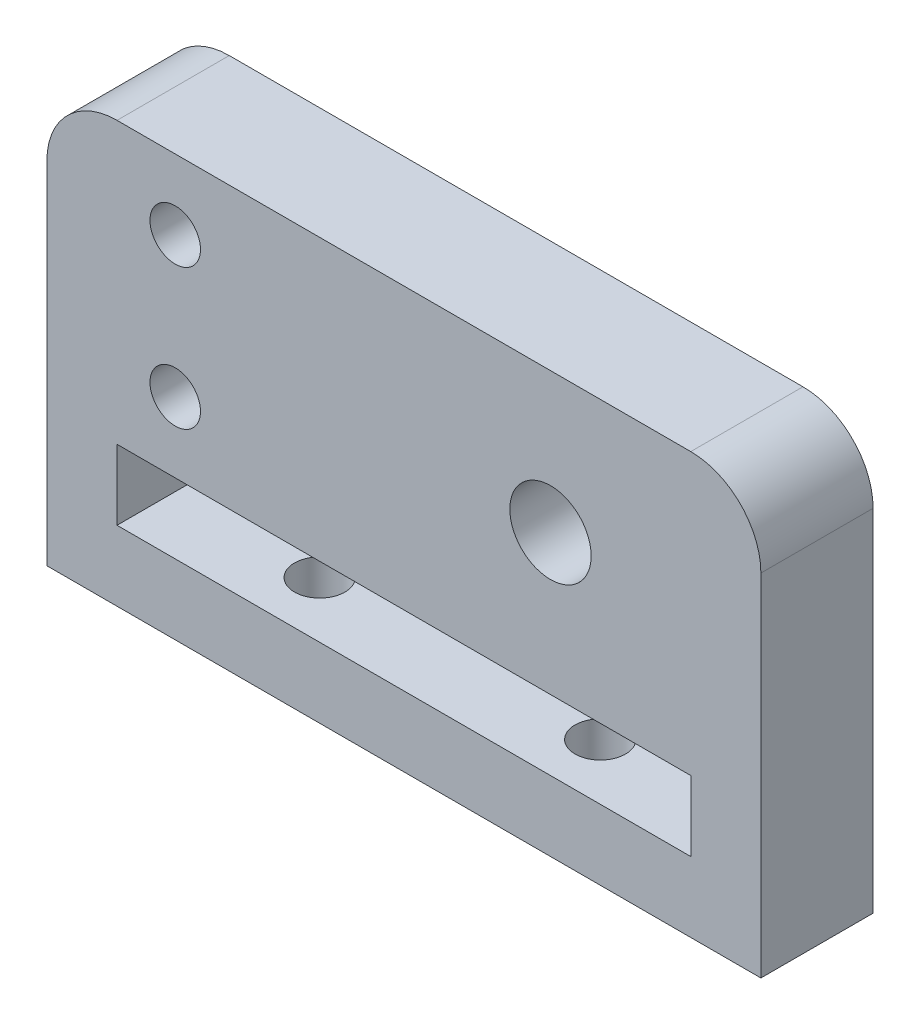
ISO-10303-21;
HEADER;
FILE_DESCRIPTION(('STEP AP214'),'2;1');
FILE_NAME('part.step','',(''),(''),'','','');
FILE_SCHEMA(('AUTOMOTIVE_DESIGN { 1 0 10303 214 1 1 1 1 }'));
ENDSEC;
DATA;
#1=APPLICATION_CONTEXT('core data for automotive mechanical design processes');
#2=APPLICATION_PROTOCOL_DEFINITION('international standard','automotive_design',2000,#1);
#3=PRODUCT_CONTEXT('',#1,'mechanical');
#4=PRODUCT('Part','Part','',(#3));
#5=PRODUCT_RELATED_PRODUCT_CATEGORY('part','',(#4));
#6=PRODUCT_DEFINITION_FORMATION('','',#4);
#7=PRODUCT_DEFINITION_CONTEXT('part definition',#1,'design');
#8=PRODUCT_DEFINITION('design','',#6,#7);
#9=PRODUCT_DEFINITION_SHAPE('','',#8);
#10=(LENGTH_UNIT() NAMED_UNIT(*) SI_UNIT(.MILLI.,.METRE.));
#11=(NAMED_UNIT(*) PLANE_ANGLE_UNIT() SI_UNIT($,.RADIAN.));
#12=(NAMED_UNIT(*) SI_UNIT($,.STERADIAN.) SOLID_ANGLE_UNIT());
#13=UNCERTAINTY_MEASURE_WITH_UNIT(LENGTH_MEASURE(1.E-05),#10,'distance_accuracy_value','');
#14=(GEOMETRIC_REPRESENTATION_CONTEXT(3) GLOBAL_UNCERTAINTY_ASSIGNED_CONTEXT((#13)) GLOBAL_UNIT_ASSIGNED_CONTEXT((#10,
#11,#12)) REPRESENTATION_CONTEXT('',''));
#15=CARTESIAN_POINT('',(0.,0.,0.));
#16=DIRECTION('',(0.,0.,1.));
#17=DIRECTION('',(1.,0.,0.));
#18=AXIS2_PLACEMENT_3D('',#15,#16,#17);
#19=CARTESIAN_POINT('',(0.,0.,8.));
#20=DIRECTION('',(0.,0.,1.));
#21=DIRECTION('',(1.,0.,0.));
#22=AXIS2_PLACEMENT_3D('',#19,#20,#21);
#23=PLANE('',#22);
#24=CARTESIAN_POINT('',(9.15,25.,8.));
#25=DIRECTION('',(0.,0.,1.));
#26=DIRECTION('',(1.,0.,0.));
#27=AXIS2_PLACEMENT_3D('',#24,#25,#26);
#28=CIRCLE('',#27,1.8);
#29=CARTESIAN_POINT('',(10.95,25.,8.));
#30=VERTEX_POINT('',#29);
#31=EDGE_CURVE('E281',#30,#30,#28,.T.);
#32=ORIENTED_EDGE('',*,*,#31,.F.);
#33=EDGE_LOOP('',(#32));
#34=FACE_BOUND('',#33,.T.);
#35=CARTESIAN_POINT('',(9.15,15.,8.));
#36=DIRECTION('',(0.,0.,1.));
#37=DIRECTION('',(1.,0.,0.));
#38=AXIS2_PLACEMENT_3D('',#35,#36,#37);
#39=CIRCLE('',#38,1.8);
#40=CARTESIAN_POINT('',(10.95,15.,8.));
#41=VERTEX_POINT('',#40);
#42=EDGE_CURVE('E274',#41,#41,#39,.T.);
#43=ORIENTED_EDGE('',*,*,#42,.F.);
#44=EDGE_LOOP('',(#43));
#45=FACE_BOUND('',#44,.T.);
#46=DIRECTION('',(0.,-1.,0.));
#47=VECTOR('',#46,1.);
#48=CARTESIAN_POINT('',(5.,10.,8.));
#49=LINE('',#48,#47);
#50=CARTESIAN_POINT('',(5.,10.,8.));
#51=VERTEX_POINT('',#50);
#52=CARTESIAN_POINT('',(5.,5.,8.));
#53=VERTEX_POINT('',#52);
#54=EDGE_CURVE('E137',#51,#53,#49,.T.);
#55=ORIENTED_EDGE('',*,*,#54,.F.);
#56=DIRECTION('',(-1.,0.,0.));
#57=VECTOR('',#56,1.);
#58=CARTESIAN_POINT('',(5.,10.,8.));
#59=LINE('',#58,#57);
#60=CARTESIAN_POINT('',(45.9,10.,8.));
#61=VERTEX_POINT('',#60);
#62=EDGE_CURVE('E126',#61,#51,#59,.T.);
#63=ORIENTED_EDGE('',*,*,#62,.F.);
#64=DIRECTION('',(0.,1.,0.));
#65=VECTOR('',#64,1.);
#66=CARTESIAN_POINT('',(45.9,10.,8.));
#67=LINE('',#66,#65);
#68=CARTESIAN_POINT('',(45.9,5.00000000000001,8.));
#69=VERTEX_POINT('',#68);
#70=EDGE_CURVE('E155',#69,#61,#67,.T.);
#71=ORIENTED_EDGE('',*,*,#70,.F.);
#72=DIRECTION('',(1.,0.,0.));
#73=VECTOR('',#72,1.);
#74=CARTESIAN_POINT('',(5.,5.,8.));
#75=LINE('',#74,#73);
#76=EDGE_CURVE('E151',#53,#69,#75,.T.);
#77=ORIENTED_EDGE('',*,*,#76,.F.);
#78=EDGE_LOOP('',(#55,#63,#71,#77));
#79=FACE_BOUND('',#78,.T.);
#80=DIRECTION('',(0.,1.,0.));
#81=VECTOR('',#80,1.);
#82=CARTESIAN_POINT('',(50.9,0.,8.));
#83=LINE('',#82,#81);
#84=CARTESIAN_POINT('',(50.9,0.,8.));
#85=VERTEX_POINT('',#84);
#86=CARTESIAN_POINT('',(50.9,25.,8.));
#87=VERTEX_POINT('',#86);
#88=EDGE_CURVE('E185',#85,#87,#83,.T.);
#89=ORIENTED_EDGE('',*,*,#88,.T.);
#90=CARTESIAN_POINT('',(45.9,25.,8.));
#91=DIRECTION('',(0.,0.,1.));
#92=DIRECTION('',(1.,0.,0.));
#93=AXIS2_PLACEMENT_3D('',#90,#91,#92);
#94=CIRCLE('',#93,5.);
#95=CARTESIAN_POINT('',(45.9,30.,8.));
#96=VERTEX_POINT('',#95);
#97=EDGE_CURVE('E53',#87,#96,#94,.T.);
#98=ORIENTED_EDGE('',*,*,#97,.T.);
#99=DIRECTION('',(-1.,0.,0.));
#100=VECTOR('',#99,1.);
#101=CARTESIAN_POINT('',(0.,30.,8.));
#102=LINE('',#101,#100);
#103=CARTESIAN_POINT('',(5.,30.,8.));
#104=VERTEX_POINT('',#103);
#105=EDGE_CURVE('E189',#96,#104,#102,.T.);
#106=ORIENTED_EDGE('',*,*,#105,.T.);
#107=CARTESIAN_POINT('',(5.,25.,8.));
#108=DIRECTION('',(0.,0.,1.));
#109=DIRECTION('',(1.,0.,0.));
#110=AXIS2_PLACEMENT_3D('',#107,#108,#109);
#111=CIRCLE('',#110,5.);
#112=CARTESIAN_POINT('',(0.,25.,8.));
#113=VERTEX_POINT('',#112);
#114=EDGE_CURVE('E61',#104,#113,#111,.T.);
#115=ORIENTED_EDGE('',*,*,#114,.T.);
#116=DIRECTION('',(0.,-1.,0.));
#117=VECTOR('',#116,1.);
#118=CARTESIAN_POINT('',(0.,0.,8.));
#119=LINE('',#118,#117);
#120=CARTESIAN_POINT('',(0.,0.,8.));
#121=VERTEX_POINT('',#120);
#122=EDGE_CURVE('E192',#113,#121,#119,.T.);
#123=ORIENTED_EDGE('',*,*,#122,.T.);
#124=DIRECTION('',(1.,0.,0.));
#125=VECTOR('',#124,1.);
#126=CARTESIAN_POINT('',(0.,0.,8.));
#127=LINE('',#126,#125);
#128=EDGE_CURVE('E181',#121,#85,#127,.T.);
#129=ORIENTED_EDGE('',*,*,#128,.T.);
#130=EDGE_LOOP('',(#89,#98,#106,#115,#123,#129));
#131=FACE_BOUND('',#130,.T.);
#132=CARTESIAN_POINT('',(35.9,20.,8.));
#133=DIRECTION('',(0.,0.,1.));
#134=DIRECTION('',(1.,0.,0.));
#135=AXIS2_PLACEMENT_3D('',#132,#133,#134);
#136=CIRCLE('',#135,2.9);
#137=CARTESIAN_POINT('',(38.8,20.,8.));
#138=VERTEX_POINT('',#137);
#139=EDGE_CURVE('E164',#138,#138,#136,.T.);
#140=ORIENTED_EDGE('',*,*,#139,.F.);
#141=EDGE_LOOP('',(#140));
#142=FACE_BOUND('',#141,.T.);
#143=ADVANCED_FACE('F43',(#34,#45,#79,#131,#142),#23,.T.);
#144=CARTESIAN_POINT('',(0.,0.,0.));
#145=DIRECTION('',(0.,0.,1.));
#146=DIRECTION('',(1.,0.,0.));
#147=AXIS2_PLACEMENT_3D('',#144,#145,#146);
#148=PLANE('',#147);
#149=CARTESIAN_POINT('',(9.15,25.,0.));
#150=DIRECTION('',(0.,0.,-1.));
#151=DIRECTION('',(-1.,0.,0.));
#152=AXIS2_PLACEMENT_3D('',#149,#150,#151);
#153=CIRCLE('',#152,1.8);
#154=CARTESIAN_POINT('',(7.35,25.,0.));
#155=VERTEX_POINT('',#154);
#156=EDGE_CURVE('E270',#155,#155,#153,.T.);
#157=ORIENTED_EDGE('',*,*,#156,.F.);
#158=EDGE_LOOP('',(#157));
#159=FACE_BOUND('',#158,.T.);
#160=CARTESIAN_POINT('',(9.15,15.,0.));
#161=DIRECTION('',(0.,0.,-1.));
#162=DIRECTION('',(-1.,0.,0.));
#163=AXIS2_PLACEMENT_3D('',#160,#161,#162);
#164=CIRCLE('',#163,1.8);
#165=CARTESIAN_POINT('',(7.35,15.,0.));
#166=VERTEX_POINT('',#165);
#167=EDGE_CURVE('E252',#166,#166,#164,.T.);
#168=ORIENTED_EDGE('',*,*,#167,.F.);
#169=EDGE_LOOP('',(#168));
#170=FACE_BOUND('',#169,.T.);
#171=DIRECTION('',(-1.,0.,0.));
#172=VECTOR('',#171,1.);
#173=CARTESIAN_POINT('',(0.,30.,0.));
#174=LINE('',#173,#172);
#175=CARTESIAN_POINT('',(45.9,30.,0.));
#176=VERTEX_POINT('',#175);
#177=CARTESIAN_POINT('',(5.,30.,0.));
#178=VERTEX_POINT('',#177);
#179=EDGE_CURVE('E202',#176,#178,#174,.T.);
#180=ORIENTED_EDGE('',*,*,#179,.F.);
#181=CARTESIAN_POINT('',(45.9,25.,0.));
#182=DIRECTION('',(0.,0.,1.));
#183=DIRECTION('',(1.,0.,0.));
#184=AXIS2_PLACEMENT_3D('',#181,#182,#183);
#185=CIRCLE('',#184,5.);
#186=CARTESIAN_POINT('',(50.9,25.,0.));
#187=VERTEX_POINT('',#186);
#188=EDGE_CURVE('E235',#176,#187,#185,.F.);
#189=ORIENTED_EDGE('',*,*,#188,.T.);
#190=DIRECTION('',(0.,1.,0.));
#191=VECTOR('',#190,1.);
#192=CARTESIAN_POINT('',(50.9,0.,0.));
#193=LINE('',#192,#191);
#194=CARTESIAN_POINT('',(50.9,0.,0.));
#195=VERTEX_POINT('',#194);
#196=EDGE_CURVE('E199',#195,#187,#193,.T.);
#197=ORIENTED_EDGE('',*,*,#196,.F.);
#198=DIRECTION('',(1.,0.,0.));
#199=VECTOR('',#198,1.);
#200=CARTESIAN_POINT('',(0.,0.,0.));
#201=LINE('',#200,#199);
#202=CARTESIAN_POINT('',(0.,0.,0.));
#203=VERTEX_POINT('',#202);
#204=EDGE_CURVE('E146',#203,#195,#201,.T.);
#205=ORIENTED_EDGE('',*,*,#204,.F.);
#206=DIRECTION('',(0.,-1.,0.));
#207=VECTOR('',#206,1.);
#208=CARTESIAN_POINT('',(0.,0.,0.));
#209=LINE('',#208,#207);
#210=CARTESIAN_POINT('',(0.,25.,0.));
#211=VERTEX_POINT('',#210);
#212=EDGE_CURVE('E186',#211,#203,#209,.T.);
#213=ORIENTED_EDGE('',*,*,#212,.F.);
#214=CARTESIAN_POINT('',(5.,25.,0.));
#215=DIRECTION('',(0.,0.,1.));
#216=DIRECTION('',(1.,0.,0.));
#217=AXIS2_PLACEMENT_3D('',#214,#215,#216);
#218=CIRCLE('',#217,5.);
#219=EDGE_CURVE('E232',#211,#178,#218,.F.);
#220=ORIENTED_EDGE('',*,*,#219,.T.);
#221=EDGE_LOOP('',(#180,#189,#197,#205,#213,#220));
#222=FACE_BOUND('',#221,.T.);
#223=DIRECTION('',(-1.,0.,0.));
#224=VECTOR('',#223,1.);
#225=CARTESIAN_POINT('',(5.,10.,0.));
#226=LINE('',#225,#224);
#227=CARTESIAN_POINT('',(45.9,10.,0.));
#228=VERTEX_POINT('',#227);
#229=CARTESIAN_POINT('',(5.,10.,0.));
#230=VERTEX_POINT('',#229);
#231=EDGE_CURVE('E161',#228,#230,#226,.T.);
#232=ORIENTED_EDGE('',*,*,#231,.T.);
#233=DIRECTION('',(0.,-1.,0.));
#234=VECTOR('',#233,1.);
#235=CARTESIAN_POINT('',(5.,10.,0.));
#236=LINE('',#235,#234);
#237=CARTESIAN_POINT('',(5.,5.,0.));
#238=VERTEX_POINT('',#237);
#239=EDGE_CURVE('E144',#230,#238,#236,.T.);
#240=ORIENTED_EDGE('',*,*,#239,.T.);
#241=DIRECTION('',(1.,0.,0.));
#242=VECTOR('',#241,1.);
#243=CARTESIAN_POINT('',(5.,5.,0.));
#244=LINE('',#243,#242);
#245=CARTESIAN_POINT('',(45.9,5.00000000000001,0.));
#246=VERTEX_POINT('',#245);
#247=EDGE_CURVE('E167',#238,#246,#244,.T.);
#248=ORIENTED_EDGE('',*,*,#247,.T.);
#249=DIRECTION('',(0.,1.,0.));
#250=VECTOR('',#249,1.);
#251=CARTESIAN_POINT('',(45.9,10.,0.));
#252=LINE('',#251,#250);
#253=EDGE_CURVE('E138',#246,#228,#252,.T.);
#254=ORIENTED_EDGE('',*,*,#253,.T.);
#255=EDGE_LOOP('',(#232,#240,#248,#254));
#256=FACE_BOUND('',#255,.T.);
#257=CARTESIAN_POINT('',(35.9,20.,0.));
#258=DIRECTION('',(0.,0.,1.));
#259=DIRECTION('',(1.,0.,0.));
#260=AXIS2_PLACEMENT_3D('',#257,#258,#259);
#261=CIRCLE('',#260,2.9);
#262=CARTESIAN_POINT('',(38.8,20.,0.));
#263=VERTEX_POINT('',#262);
#264=EDGE_CURVE('E225',#263,#263,#261,.T.);
#265=ORIENTED_EDGE('',*,*,#264,.T.);
#266=EDGE_LOOP('',(#265));
#267=FACE_BOUND('',#266,.T.);
#268=ADVANCED_FACE('F306',(#159,#170,#222,#256,#267),#148,.F.);
#269=CARTESIAN_POINT('',(0.,0.,8.));
#270=DIRECTION('',(0.,1.,0.));
#271=DIRECTION('',(0.,0.,1.));
#272=AXIS2_PLACEMENT_3D('',#269,#270,#271);
#273=PLANE('',#272);
#274=CARTESIAN_POINT('',(15.45,0.,4.));
#275=DIRECTION('',(0.,-1.,0.));
#276=DIRECTION('',(0.,0.,-1.));
#277=AXIS2_PLACEMENT_3D('',#274,#275,#276);
#278=CIRCLE('',#277,1.8);
#279=CARTESIAN_POINT('',(15.45,0.,2.2));
#280=VERTEX_POINT('',#279);
#281=EDGE_CURVE('E289',#280,#280,#278,.T.);
#282=ORIENTED_EDGE('',*,*,#281,.F.);
#283=EDGE_LOOP('',(#282));
#284=FACE_BOUND('',#283,.T.);
#285=CARTESIAN_POINT('',(35.45,0.,4.));
#286=DIRECTION('',(0.,-1.,0.));
#287=DIRECTION('',(0.,0.,-1.));
#288=AXIS2_PLACEMENT_3D('',#285,#286,#287);
#289=CIRCLE('',#288,1.8);
#290=CARTESIAN_POINT('',(35.45,0.,2.2));
#291=VERTEX_POINT('',#290);
#292=EDGE_CURVE('E293',#291,#291,#289,.T.);
#293=ORIENTED_EDGE('',*,*,#292,.F.);
#294=EDGE_LOOP('',(#293));
#295=FACE_BOUND('',#294,.T.);
#296=ORIENTED_EDGE('',*,*,#204,.T.);
#297=DIRECTION('',(0.,0.,-1.));
#298=VECTOR('',#297,1.);
#299=CARTESIAN_POINT('',(50.9,0.,8.));
#300=LINE('',#299,#298);
#301=EDGE_CURVE('E211',#85,#195,#300,.T.);
#302=ORIENTED_EDGE('',*,*,#301,.F.);
#303=ORIENTED_EDGE('',*,*,#128,.F.);
#304=DIRECTION('',(0.,0.,-1.));
#305=VECTOR('',#304,1.);
#306=CARTESIAN_POINT('',(0.,0.,8.));
#307=LINE('',#306,#305);
#308=EDGE_CURVE('E195',#121,#203,#307,.T.);
#309=ORIENTED_EDGE('',*,*,#308,.T.);
#310=EDGE_LOOP('',(#296,#302,#303,#309));
#311=FACE_BOUND('',#310,.T.);
#312=ADVANCED_FACE('F332',(#284,#295,#311),#273,.F.);
#313=CARTESIAN_POINT('',(50.9,0.,8.));
#314=DIRECTION('',(-1.,0.,0.));
#315=DIRECTION('',(0.,0.,1.));
#316=AXIS2_PLACEMENT_3D('',#313,#314,#315);
#317=PLANE('',#316);
#318=ORIENTED_EDGE('',*,*,#196,.T.);
#319=DIRECTION('',(0.,0.,-1.));
#320=VECTOR('',#319,1.);
#321=CARTESIAN_POINT('',(50.9,25.,8.));
#322=LINE('',#321,#320);
#323=EDGE_CURVE('E69',#187,#87,#322,.F.);
#324=ORIENTED_EDGE('',*,*,#323,.T.);
#325=ORIENTED_EDGE('',*,*,#88,.F.);
#326=ORIENTED_EDGE('',*,*,#301,.T.);
#327=EDGE_LOOP('',(#318,#324,#325,#326));
#328=FACE_BOUND('',#327,.T.);
#329=ADVANCED_FACE('F347',(#328),#317,.F.);
#330=CARTESIAN_POINT('',(0.,30.,8.));
#331=DIRECTION('',(0.,-1.,0.));
#332=DIRECTION('',(1.,0.,0.));
#333=AXIS2_PLACEMENT_3D('',#330,#331,#332);
#334=PLANE('',#333);
#335=ORIENTED_EDGE('',*,*,#105,.F.);
#336=DIRECTION('',(0.,0.,-1.));
#337=VECTOR('',#336,1.);
#338=CARTESIAN_POINT('',(45.9,30.,8.));
#339=LINE('',#338,#337);
#340=EDGE_CURVE('E228',#96,#176,#339,.T.);
#341=ORIENTED_EDGE('',*,*,#340,.T.);
#342=ORIENTED_EDGE('',*,*,#179,.T.);
#343=DIRECTION('',(0.,0.,-1.));
#344=VECTOR('',#343,1.);
#345=CARTESIAN_POINT('',(5.,30.,8.));
#346=LINE('',#345,#344);
#347=EDGE_CURVE('E215',#178,#104,#346,.F.);
#348=ORIENTED_EDGE('',*,*,#347,.T.);
#349=EDGE_LOOP('',(#335,#341,#342,#348));
#350=FACE_BOUND('',#349,.T.);
#351=ADVANCED_FACE('F343',(#350),#334,.F.);
#352=CARTESIAN_POINT('',(0.,0.,8.));
#353=DIRECTION('',(1.,0.,0.));
#354=DIRECTION('',(0.,0.,-1.));
#355=AXIS2_PLACEMENT_3D('',#352,#353,#354);
#356=PLANE('',#355);
#357=ORIENTED_EDGE('',*,*,#122,.F.);
#358=DIRECTION('',(0.,0.,-1.));
#359=VECTOR('',#358,1.);
#360=CARTESIAN_POINT('',(0.,25.,8.));
#361=LINE('',#360,#359);
#362=EDGE_CURVE('E11',#113,#211,#361,.T.);
#363=ORIENTED_EDGE('',*,*,#362,.T.);
#364=ORIENTED_EDGE('',*,*,#212,.T.);
#365=ORIENTED_EDGE('',*,*,#308,.F.);
#366=EDGE_LOOP('',(#357,#363,#364,#365));
#367=FACE_BOUND('',#366,.T.);
#368=ADVANCED_FACE('F340',(#367),#356,.F.);
#369=CARTESIAN_POINT('',(5.,10.,8.));
#370=DIRECTION('',(0.,-1.,0.));
#371=DIRECTION('',(1.,0.,0.));
#372=AXIS2_PLACEMENT_3D('',#369,#370,#371);
#373=PLANE('',#372);
#374=CARTESIAN_POINT('',(15.45,10.,4.));
#375=DIRECTION('',(0.,-1.,0.));
#376=DIRECTION('',(1.,0.,0.));
#377=AXIS2_PLACEMENT_3D('',#374,#375,#376);
#378=CIRCLE('',#377,3.5);
#379=CARTESIAN_POINT('',(18.95,10.,4.));
#380=VERTEX_POINT('',#379);
#381=EDGE_CURVE('E254',#380,#380,#378,.T.);
#382=ORIENTED_EDGE('',*,*,#381,.F.);
#383=EDGE_LOOP('',(#382));
#384=FACE_BOUND('',#383,.T.);
#385=CARTESIAN_POINT('',(35.45,10.,4.));
#386=DIRECTION('',(0.,-1.,0.));
#387=DIRECTION('',(1.,0.,0.));
#388=AXIS2_PLACEMENT_3D('',#385,#386,#387);
#389=CIRCLE('',#388,3.5);
#390=CARTESIAN_POINT('',(38.95,10.,4.));
#391=VERTEX_POINT('',#390);
#392=EDGE_CURVE('E260',#391,#391,#389,.T.);
#393=ORIENTED_EDGE('',*,*,#392,.F.);
#394=EDGE_LOOP('',(#393));
#395=FACE_BOUND('',#394,.T.);
#396=ORIENTED_EDGE('',*,*,#231,.F.);
#397=DIRECTION('',(0.,0.,-1.));
#398=VECTOR('',#397,1.);
#399=CARTESIAN_POINT('',(45.9,10.,8.));
#400=LINE('',#399,#398);
#401=EDGE_CURVE('E132',#61,#228,#400,.T.);
#402=ORIENTED_EDGE('',*,*,#401,.F.);
#403=ORIENTED_EDGE('',*,*,#62,.T.);
#404=DIRECTION('',(0.,0.,-1.));
#405=VECTOR('',#404,1.);
#406=CARTESIAN_POINT('',(5.,10.,8.));
#407=LINE('',#406,#405);
#408=EDGE_CURVE('E129',#51,#230,#407,.T.);
#409=ORIENTED_EDGE('',*,*,#408,.T.);
#410=EDGE_LOOP('',(#396,#402,#403,#409));
#411=FACE_BOUND('',#410,.T.);
#412=ADVANCED_FACE('F128',(#384,#395,#411),#373,.T.);
#413=CARTESIAN_POINT('',(5.,10.,8.));
#414=DIRECTION('',(1.,0.,0.));
#415=DIRECTION('',(0.,1.,0.));
#416=AXIS2_PLACEMENT_3D('',#413,#414,#415);
#417=PLANE('',#416);
#418=ORIENTED_EDGE('',*,*,#239,.F.);
#419=ORIENTED_EDGE('',*,*,#408,.F.);
#420=ORIENTED_EDGE('',*,*,#54,.T.);
#421=DIRECTION('',(0.,0.,-1.));
#422=VECTOR('',#421,1.);
#423=CARTESIAN_POINT('',(5.,5.,8.));
#424=LINE('',#423,#422);
#425=EDGE_CURVE('E147',#53,#238,#424,.T.);
#426=ORIENTED_EDGE('',*,*,#425,.T.);
#427=EDGE_LOOP('',(#418,#419,#420,#426));
#428=FACE_BOUND('',#427,.T.);
#429=ADVANCED_FACE('F141',(#428),#417,.T.);
#430=CARTESIAN_POINT('',(5.,5.,8.));
#431=DIRECTION('',(0.,1.,0.));
#432=DIRECTION('',(-1.,0.,0.));
#433=AXIS2_PLACEMENT_3D('',#430,#431,#432);
#434=PLANE('',#433);
#435=CARTESIAN_POINT('',(15.45,5.,4.));
#436=DIRECTION('',(0.,1.,0.));
#437=DIRECTION('',(-1.,0.,0.));
#438=AXIS2_PLACEMENT_3D('',#435,#436,#437);
#439=CIRCLE('',#438,1.8);
#440=CARTESIAN_POINT('',(13.65,5.,4.));
#441=VERTEX_POINT('',#440);
#442=EDGE_CURVE('E220',#441,#441,#439,.T.);
#443=ORIENTED_EDGE('',*,*,#442,.F.);
#444=EDGE_LOOP('',(#443));
#445=FACE_BOUND('',#444,.T.);
#446=CARTESIAN_POINT('',(35.45,5.00000000000001,4.));
#447=DIRECTION('',(0.,1.,0.));
#448=DIRECTION('',(-1.,0.,0.));
#449=AXIS2_PLACEMENT_3D('',#446,#447,#448);
#450=CIRCLE('',#449,1.8);
#451=CARTESIAN_POINT('',(33.65,5.00000000000001,4.));
#452=VERTEX_POINT('',#451);
#453=EDGE_CURVE('E216',#452,#452,#450,.T.);
#454=ORIENTED_EDGE('',*,*,#453,.F.);
#455=EDGE_LOOP('',(#454));
#456=FACE_BOUND('',#455,.T.);
#457=ORIENTED_EDGE('',*,*,#247,.F.);
#458=ORIENTED_EDGE('',*,*,#425,.F.);
#459=ORIENTED_EDGE('',*,*,#76,.T.);
#460=DIRECTION('',(0.,0.,-1.));
#461=VECTOR('',#460,1.);
#462=CARTESIAN_POINT('',(45.9,5.00000000000001,8.));
#463=LINE('',#462,#461);
#464=EDGE_CURVE('E176',#69,#246,#463,.T.);
#465=ORIENTED_EDGE('',*,*,#464,.T.);
#466=EDGE_LOOP('',(#457,#458,#459,#465));
#467=FACE_BOUND('',#466,.T.);
#468=ADVANCED_FACE('F322',(#445,#456,#467),#434,.T.);
#469=CARTESIAN_POINT('',(45.9,10.,8.));
#470=DIRECTION('',(-1.,0.,0.));
#471=DIRECTION('',(0.,0.,1.));
#472=AXIS2_PLACEMENT_3D('',#469,#470,#471);
#473=PLANE('',#472);
#474=ORIENTED_EDGE('',*,*,#253,.F.);
#475=ORIENTED_EDGE('',*,*,#464,.F.);
#476=ORIENTED_EDGE('',*,*,#70,.T.);
#477=ORIENTED_EDGE('',*,*,#401,.T.);
#478=EDGE_LOOP('',(#474,#475,#476,#477));
#479=FACE_BOUND('',#478,.T.);
#480=ADVANCED_FACE('F311',(#479),#473,.T.);
#481=CARTESIAN_POINT('',(35.9,20.,8.));
#482=DIRECTION('',(0.,0.,-1.));
#483=DIRECTION('',(-1.,0.,0.));
#484=AXIS2_PLACEMENT_3D('',#481,#482,#483);
#485=CYLINDRICAL_SURFACE('',#484,2.9);
#486=ORIENTED_EDGE('',*,*,#139,.T.);
#487=EDGE_LOOP('',(#486));
#488=FACE_BOUND('',#487,.T.);
#489=ORIENTED_EDGE('',*,*,#264,.F.);
#490=EDGE_LOOP('',(#489));
#491=FACE_BOUND('',#490,.T.);
#492=ADVANCED_FACE('F308',(#488,#491),#485,.F.);
#493=CARTESIAN_POINT('',(35.45,15.,4.));
#494=DIRECTION('',(0.,-1.,0.));
#495=DIRECTION('',(0.,0.,-1.));
#496=AXIS2_PLACEMENT_3D('',#493,#494,#495);
#497=CYLINDRICAL_SURFACE('',#496,1.8);
#498=ORIENTED_EDGE('',*,*,#453,.T.);
#499=EDGE_LOOP('',(#498));
#500=FACE_BOUND('',#499,.T.);
#501=ORIENTED_EDGE('',*,*,#292,.T.);
#502=EDGE_LOOP('',(#501));
#503=FACE_BOUND('',#502,.T.);
#504=ADVANCED_FACE('F310',(#500,#503),#497,.F.);
#505=CARTESIAN_POINT('',(15.45,15.,4.));
#506=DIRECTION('',(0.,-1.,0.));
#507=DIRECTION('',(0.,0.,-1.));
#508=AXIS2_PLACEMENT_3D('',#505,#506,#507);
#509=CYLINDRICAL_SURFACE('',#508,1.8);
#510=ORIENTED_EDGE('',*,*,#442,.T.);
#511=EDGE_LOOP('',(#510));
#512=FACE_BOUND('',#511,.T.);
#513=ORIENTED_EDGE('',*,*,#281,.T.);
#514=EDGE_LOOP('',(#513));
#515=FACE_BOUND('',#514,.T.);
#516=ADVANCED_FACE('F318',(#512,#515),#509,.F.);
#517=CARTESIAN_POINT('',(45.9,25.,8.));
#518=DIRECTION('',(0.,0.,-1.));
#519=DIRECTION('',(-1.,0.,0.));
#520=AXIS2_PLACEMENT_3D('',#517,#518,#519);
#521=CYLINDRICAL_SURFACE('',#520,5.);
#522=ORIENTED_EDGE('',*,*,#97,.F.);
#523=ORIENTED_EDGE('',*,*,#323,.F.);
#524=ORIENTED_EDGE('',*,*,#188,.F.);
#525=ORIENTED_EDGE('',*,*,#340,.F.);
#526=EDGE_LOOP('',(#522,#523,#524,#525));
#527=FACE_BOUND('',#526,.T.);
#528=ADVANCED_FACE('F353',(#527),#521,.T.);
#529=CARTESIAN_POINT('',(5.,25.,8.));
#530=DIRECTION('',(0.,0.,-1.));
#531=DIRECTION('',(-1.,0.,0.));
#532=AXIS2_PLACEMENT_3D('',#529,#530,#531);
#533=CYLINDRICAL_SURFACE('',#532,5.);
#534=ORIENTED_EDGE('',*,*,#114,.F.);
#535=ORIENTED_EDGE('',*,*,#347,.F.);
#536=ORIENTED_EDGE('',*,*,#219,.F.);
#537=ORIENTED_EDGE('',*,*,#362,.F.);
#538=EDGE_LOOP('',(#534,#535,#536,#537));
#539=FACE_BOUND('',#538,.T.);
#540=ADVANCED_FACE('F45',(#539),#533,.T.);
#541=CARTESIAN_POINT('',(9.15,15.,10.));
#542=DIRECTION('',(0.,0.,-1.));
#543=DIRECTION('',(-1.,0.,0.));
#544=AXIS2_PLACEMENT_3D('',#541,#542,#543);
#545=CYLINDRICAL_SURFACE('',#544,1.8);
#546=ORIENTED_EDGE('',*,*,#42,.T.);
#547=EDGE_LOOP('',(#546));
#548=FACE_BOUND('',#547,.T.);
#549=ORIENTED_EDGE('',*,*,#167,.T.);
#550=EDGE_LOOP('',(#549));
#551=FACE_BOUND('',#550,.T.);
#552=ADVANCED_FACE('F360',(#548,#551),#545,.F.);
#553=CARTESIAN_POINT('',(9.15,25.,10.));
#554=DIRECTION('',(0.,0.,-1.));
#555=DIRECTION('',(-1.,0.,0.));
#556=AXIS2_PLACEMENT_3D('',#553,#554,#555);
#557=CYLINDRICAL_SURFACE('',#556,1.8);
#558=ORIENTED_EDGE('',*,*,#31,.T.);
#559=EDGE_LOOP('',(#558));
#560=FACE_BOUND('',#559,.T.);
#561=ORIENTED_EDGE('',*,*,#156,.T.);
#562=EDGE_LOOP('',(#561));
#563=FACE_BOUND('',#562,.T.);
#564=ADVANCED_FACE('F426',(#560,#563),#557,.F.);
#565=CARTESIAN_POINT('',(15.45,13.5,4.));
#566=DIRECTION('',(0.,-1.,0.));
#567=DIRECTION('',(1.,0.,0.));
#568=AXIS2_PLACEMENT_3D('',#565,#566,#567);
#569=PLANE('',#568);
#570=CARTESIAN_POINT('',(15.45,13.5,4.));
#571=DIRECTION('',(0.,-1.,0.));
#572=DIRECTION('',(1.,0.,0.));
#573=AXIS2_PLACEMENT_3D('',#570,#571,#572);
#574=CIRCLE('',#573,3.5);
#575=CARTESIAN_POINT('',(18.95,13.5,4.));
#576=VERTEX_POINT('',#575);
#577=EDGE_CURVE('E246',#576,#576,#574,.T.);
#578=ORIENTED_EDGE('',*,*,#577,.T.);
#579=EDGE_LOOP('',(#578));
#580=FACE_BOUND('',#579,.T.);
#581=CARTESIAN_POINT('',(15.45,13.5,4.));
#582=DIRECTION('',(0.,-1.,0.));
#583=DIRECTION('',(1.,0.,0.));
#584=AXIS2_PLACEMENT_3D('',#581,#582,#583);
#585=CIRCLE('',#584,1.8);
#586=CARTESIAN_POINT('',(17.25,13.5,4.));
#587=VERTEX_POINT('',#586);
#588=EDGE_CURVE('E243',#587,#587,#585,.F.);
#589=ORIENTED_EDGE('',*,*,#588,.T.);
#590=EDGE_LOOP('',(#589));
#591=FACE_BOUND('',#590,.T.);
#592=ADVANCED_FACE('F429',(#580,#591),#569,.T.);
#593=CARTESIAN_POINT('',(15.45,13.5,4.));
#594=DIRECTION('',(0.,-1.,0.));
#595=DIRECTION('',(1.,0.,0.));
#596=AXIS2_PLACEMENT_3D('',#593,#594,#595);
#597=CYLINDRICAL_SURFACE('',#596,3.5);
#598=ORIENTED_EDGE('',*,*,#577,.F.);
#599=EDGE_LOOP('',(#598));
#600=FACE_BOUND('',#599,.T.);
#601=ORIENTED_EDGE('',*,*,#381,.T.);
#602=EDGE_LOOP('',(#601));
#603=FACE_BOUND('',#602,.T.);
#604=ADVANCED_FACE('F419',(#600,#603),#597,.F.);
#605=CARTESIAN_POINT('',(35.45,13.5,4.));
#606=DIRECTION('',(0.,-1.,0.));
#607=DIRECTION('',(1.,0.,0.));
#608=AXIS2_PLACEMENT_3D('',#605,#606,#607);
#609=PLANE('',#608);
#610=CARTESIAN_POINT('',(35.45,13.5,4.));
#611=DIRECTION('',(0.,-1.,0.));
#612=DIRECTION('',(1.,0.,0.));
#613=AXIS2_PLACEMENT_3D('',#610,#611,#612);
#614=CIRCLE('',#613,3.5);
#615=CARTESIAN_POINT('',(38.95,13.5,4.));
#616=VERTEX_POINT('',#615);
#617=EDGE_CURVE('E266',#616,#616,#614,.T.);
#618=ORIENTED_EDGE('',*,*,#617,.T.);
#619=EDGE_LOOP('',(#618));
#620=FACE_BOUND('',#619,.T.);
#621=CARTESIAN_POINT('',(35.45,13.5,4.));
#622=DIRECTION('',(0.,-1.,0.));
#623=DIRECTION('',(1.,0.,0.));
#624=AXIS2_PLACEMENT_3D('',#621,#622,#623);
#625=CIRCLE('',#624,1.8);
#626=CARTESIAN_POINT('',(37.25,13.5,4.));
#627=VERTEX_POINT('',#626);
#628=EDGE_CURVE('E47',#627,#627,#625,.F.);
#629=ORIENTED_EDGE('',*,*,#628,.T.);
#630=EDGE_LOOP('',(#629));
#631=FACE_BOUND('',#630,.T.);
#632=ADVANCED_FACE('F410',(#620,#631),#609,.T.);
#633=CARTESIAN_POINT('',(35.45,13.5,4.));
#634=DIRECTION('',(0.,-1.,0.));
#635=DIRECTION('',(1.,0.,0.));
#636=AXIS2_PLACEMENT_3D('',#633,#634,#635);
#637=CYLINDRICAL_SURFACE('',#636,3.5);
#638=ORIENTED_EDGE('',*,*,#617,.F.);
#639=EDGE_LOOP('',(#638));
#640=FACE_BOUND('',#639,.T.);
#641=ORIENTED_EDGE('',*,*,#392,.T.);
#642=EDGE_LOOP('',(#641));
#643=FACE_BOUND('',#642,.T.);
#644=ADVANCED_FACE('F407',(#640,#643),#637,.F.);
#645=CARTESIAN_POINT('',(15.45,15.,4.));
#646=DIRECTION('',(0.,-1.,0.));
#647=DIRECTION('',(0.,0.,-1.));
#648=AXIS2_PLACEMENT_3D('',#645,#646,#647);
#649=PLANE('',#648);
#650=CARTESIAN_POINT('',(15.45,15.,4.));
#651=DIRECTION('',(0.,-1.,0.));
#652=DIRECTION('',(0.,0.,-1.));
#653=AXIS2_PLACEMENT_3D('',#650,#651,#652);
#654=CIRCLE('',#653,1.8);
#655=CARTESIAN_POINT('',(15.45,15.,2.2));
#656=VERTEX_POINT('',#655);
#657=EDGE_CURVE('E221',#656,#656,#654,.T.);
#658=ORIENTED_EDGE('',*,*,#657,.T.);
#659=EDGE_LOOP('',(#658));
#660=FACE_BOUND('',#659,.T.);
#661=ADVANCED_FACE('F409',(#660),#649,.T.);
#662=ORIENTED_EDGE('',*,*,#657,.F.);
#663=EDGE_LOOP('',(#662));
#664=FACE_BOUND('',#663,.T.);
#665=ORIENTED_EDGE('',*,*,#588,.F.);
#666=EDGE_LOOP('',(#665));
#667=FACE_BOUND('',#666,.T.);
#668=ADVANCED_FACE('F364',(#664,#667),#509,.F.);
#669=CARTESIAN_POINT('',(35.45,15.,4.));
#670=DIRECTION('',(0.,-1.,0.));
#671=DIRECTION('',(0.,0.,-1.));
#672=AXIS2_PLACEMENT_3D('',#669,#670,#671);
#673=PLANE('',#672);
#674=CARTESIAN_POINT('',(35.45,15.,4.));
#675=DIRECTION('',(0.,-1.,0.));
#676=DIRECTION('',(0.,0.,-1.));
#677=AXIS2_PLACEMENT_3D('',#674,#675,#676);
#678=CIRCLE('',#677,1.8);
#679=CARTESIAN_POINT('',(35.45,15.,2.2));
#680=VERTEX_POINT('',#679);
#681=EDGE_CURVE('E285',#680,#680,#678,.T.);
#682=ORIENTED_EDGE('',*,*,#681,.T.);
#683=EDGE_LOOP('',(#682));
#684=FACE_BOUND('',#683,.T.);
#685=ADVANCED_FACE('F433',(#684),#673,.T.);
#686=ORIENTED_EDGE('',*,*,#681,.F.);
#687=EDGE_LOOP('',(#686));
#688=FACE_BOUND('',#687,.T.);
#689=ORIENTED_EDGE('',*,*,#628,.F.);
#690=EDGE_LOOP('',(#689));
#691=FACE_BOUND('',#690,.T.);
#692=ADVANCED_FACE('F321',(#688,#691),#497,.F.);
#693=CLOSED_SHELL('',(#143,#268,#312,#329,#351,#368,#412,#429,#468,#480,#492,#504,#516,#528,
#540,#552,#564,#592,#604,#632,#644,#661,#668,#685,#692));
#694=MANIFOLD_SOLID_BREP('B2',#693);
#695=ADVANCED_BREP_SHAPE_REPRESENTATION('',(#18,#694),#14);
#696=SHAPE_DEFINITION_REPRESENTATION(#9,#695);
ENDSEC;
END-ISO-10303-21;
